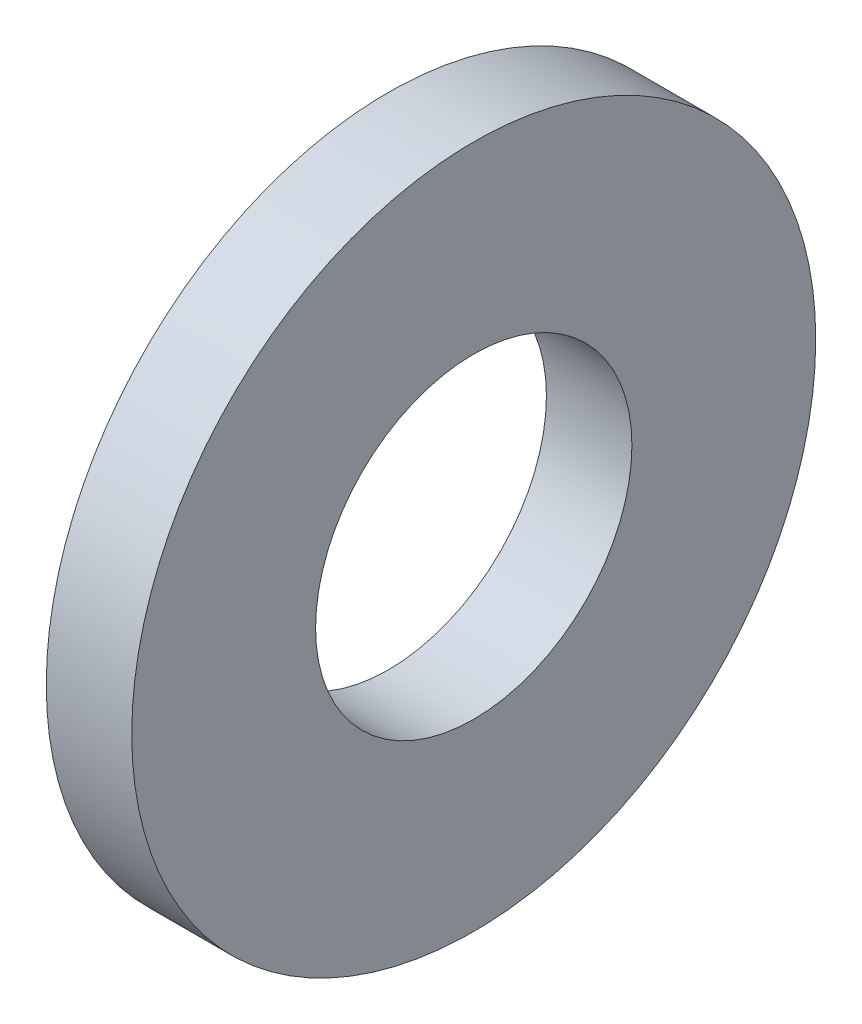
ISO-10303-21;
HEADER;
FILE_DESCRIPTION(('STEP AP214'),'2;1');
FILE_NAME('part.step','',(''),(''),'','','');
FILE_SCHEMA(('AUTOMOTIVE_DESIGN { 1 0 10303 214 1 1 1 1 }'));
ENDSEC;
DATA;
#1=APPLICATION_CONTEXT('core data for automotive mechanical design processes');
#2=APPLICATION_PROTOCOL_DEFINITION('international standard','automotive_design',2000,#1);
#3=PRODUCT_CONTEXT('',#1,'mechanical');
#4=PRODUCT('Part','Part','',(#3));
#5=PRODUCT_RELATED_PRODUCT_CATEGORY('part','',(#4));
#6=PRODUCT_DEFINITION_FORMATION('','',#4);
#7=PRODUCT_DEFINITION_CONTEXT('part definition',#1,'design');
#8=PRODUCT_DEFINITION('design','',#6,#7);
#9=PRODUCT_DEFINITION_SHAPE('','',#8);
#10=(LENGTH_UNIT() NAMED_UNIT(*) SI_UNIT(.MILLI.,.METRE.));
#11=(NAMED_UNIT(*) PLANE_ANGLE_UNIT() SI_UNIT($,.RADIAN.));
#12=(NAMED_UNIT(*) SI_UNIT($,.STERADIAN.) SOLID_ANGLE_UNIT());
#13=UNCERTAINTY_MEASURE_WITH_UNIT(LENGTH_MEASURE(1.E-05),#10,'distance_accuracy_value','');
#14=(GEOMETRIC_REPRESENTATION_CONTEXT(3) GLOBAL_UNCERTAINTY_ASSIGNED_CONTEXT((#13)) GLOBAL_UNIT_ASSIGNED_CONTEXT((#10,
#11,#12)) REPRESENTATION_CONTEXT('',''));
#15=CARTESIAN_POINT('',(0.,0.,0.));
#16=DIRECTION('',(0.,0.,1.));
#17=DIRECTION('',(1.,0.,0.));
#18=AXIS2_PLACEMENT_3D('',#15,#16,#17);
#19=CARTESIAN_POINT('',(2.,0.,0.));
#20=DIRECTION('',(1.,0.,0.));
#21=DIRECTION('',(0.,0.,-1.));
#22=AXIS2_PLACEMENT_3D('',#19,#20,#21);
#23=PLANE('',#22);
#24=CARTESIAN_POINT('',(2.,0.,0.));
#25=DIRECTION('',(1.,0.,0.));
#26=DIRECTION('',(0.,0.,-1.));
#27=AXIS2_PLACEMENT_3D('',#24,#25,#26);
#28=CIRCLE('',#27,8.);
#29=CARTESIAN_POINT('',(2.,0.,-8.));
#30=VERTEX_POINT('',#29);
#31=EDGE_CURVE('E10',#30,#30,#28,.T.);
#32=ORIENTED_EDGE('',*,*,#31,.T.);
#33=EDGE_LOOP('',(#32));
#34=FACE_BOUND('',#33,.T.);
#35=CARTESIAN_POINT('',(2.,0.,0.));
#36=DIRECTION('',(1.,0.,0.));
#37=DIRECTION('',(0.,0.,-1.));
#38=AXIS2_PLACEMENT_3D('',#35,#36,#37);
#39=CIRCLE('',#38,3.7);
#40=CARTESIAN_POINT('',(2.,0.,-3.7));
#41=VERTEX_POINT('',#40);
#42=EDGE_CURVE('E48',#41,#41,#39,.T.);
#43=ORIENTED_EDGE('',*,*,#42,.F.);
#44=EDGE_LOOP('',(#43));
#45=FACE_BOUND('',#44,.T.);
#46=ADVANCED_FACE('F37',(#34,#45),#23,.T.);
#47=CARTESIAN_POINT('',(0.,0.,0.));
#48=DIRECTION('',(1.,0.,0.));
#49=DIRECTION('',(0.,0.,-1.));
#50=AXIS2_PLACEMENT_3D('',#47,#48,#49);
#51=PLANE('',#50);
#52=CARTESIAN_POINT('',(0.,0.,0.));
#53=DIRECTION('',(1.,0.,0.));
#54=DIRECTION('',(0.,0.,-1.));
#55=AXIS2_PLACEMENT_3D('',#52,#53,#54);
#56=CIRCLE('',#55,8.);
#57=CARTESIAN_POINT('',(0.,0.,-8.));
#58=VERTEX_POINT('',#57);
#59=EDGE_CURVE('E41',#58,#58,#56,.T.);
#60=ORIENTED_EDGE('',*,*,#59,.F.);
#61=EDGE_LOOP('',(#60));
#62=FACE_BOUND('',#61,.T.);
#63=CARTESIAN_POINT('',(0.,0.,0.));
#64=DIRECTION('',(1.,0.,0.));
#65=DIRECTION('',(0.,0.,-1.));
#66=AXIS2_PLACEMENT_3D('',#63,#64,#65);
#67=CIRCLE('',#66,3.7);
#68=CARTESIAN_POINT('',(0.,0.,-3.7));
#69=VERTEX_POINT('',#68);
#70=EDGE_CURVE('E50',#69,#69,#67,.T.);
#71=ORIENTED_EDGE('',*,*,#70,.T.);
#72=EDGE_LOOP('',(#71));
#73=FACE_BOUND('',#72,.T.);
#74=ADVANCED_FACE('F60',(#62,#73),#51,.F.);
#75=CARTESIAN_POINT('',(2.,0.,0.));
#76=DIRECTION('',(-1.,0.,0.));
#77=DIRECTION('',(0.,0.,1.));
#78=AXIS2_PLACEMENT_3D('',#75,#76,#77);
#79=CYLINDRICAL_SURFACE('',#78,8.);
#80=ORIENTED_EDGE('',*,*,#31,.F.);
#81=EDGE_LOOP('',(#80));
#82=FACE_BOUND('',#81,.T.);
#83=ORIENTED_EDGE('',*,*,#59,.T.);
#84=EDGE_LOOP('',(#83));
#85=FACE_BOUND('',#84,.T.);
#86=ADVANCED_FACE('F39',(#82,#85),#79,.T.);
#87=CARTESIAN_POINT('',(2.,0.,0.));
#88=DIRECTION('',(-1.,0.,0.));
#89=DIRECTION('',(0.,0.,1.));
#90=AXIS2_PLACEMENT_3D('',#87,#88,#89);
#91=CYLINDRICAL_SURFACE('',#90,3.7);
#92=ORIENTED_EDGE('',*,*,#42,.T.);
#93=EDGE_LOOP('',(#92));
#94=FACE_BOUND('',#93,.T.);
#95=ORIENTED_EDGE('',*,*,#70,.F.);
#96=EDGE_LOOP('',(#95));
#97=FACE_BOUND('',#96,.T.);
#98=ADVANCED_FACE('F56',(#94,#97),#91,.F.);
#99=CLOSED_SHELL('',(#46,#74,#86,#98));
#100=MANIFOLD_SOLID_BREP('B2',#99);
#101=ADVANCED_BREP_SHAPE_REPRESENTATION('',(#18,#100),#14);
#102=SHAPE_DEFINITION_REPRESENTATION(#9,#101);
ENDSEC;
END-ISO-10303-21;
